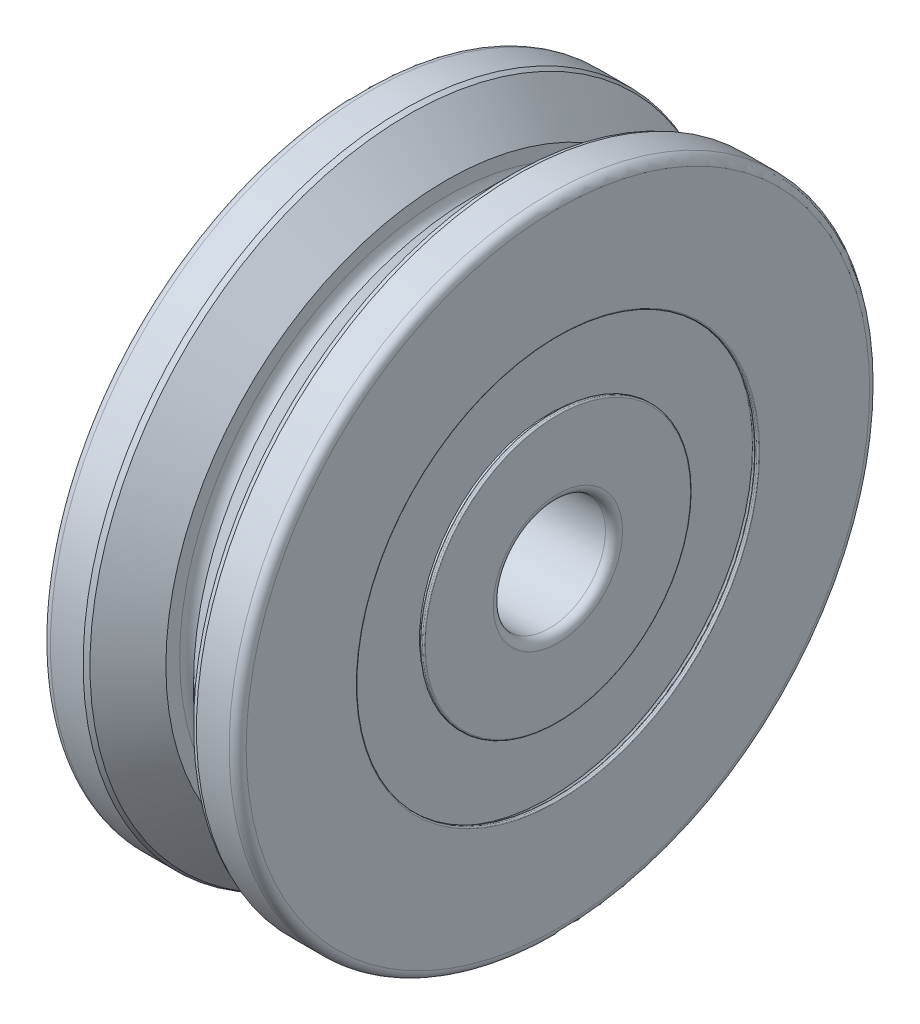
ISO-10303-21;
HEADER;
FILE_DESCRIPTION(('STEP AP214'),'2;1');
FILE_NAME('part.step','',(''),(''),'','','');
FILE_SCHEMA(('AUTOMOTIVE_DESIGN { 1 0 10303 214 1 1 1 1 }'));
ENDSEC;
DATA;
#1=APPLICATION_CONTEXT('core data for automotive mechanical design processes');
#2=APPLICATION_PROTOCOL_DEFINITION('international standard','automotive_design',2000,#1);
#3=PRODUCT_CONTEXT('',#1,'mechanical');
#4=PRODUCT('Part','Part','',(#3));
#5=PRODUCT_RELATED_PRODUCT_CATEGORY('part','',(#4));
#6=PRODUCT_DEFINITION_FORMATION('','',#4);
#7=PRODUCT_DEFINITION_CONTEXT('part definition',#1,'design');
#8=PRODUCT_DEFINITION('design','',#6,#7);
#9=PRODUCT_DEFINITION_SHAPE('','',#8);
#10=(LENGTH_UNIT() NAMED_UNIT(*) SI_UNIT(.MILLI.,.METRE.));
#11=(NAMED_UNIT(*) PLANE_ANGLE_UNIT() SI_UNIT($,.RADIAN.));
#12=(NAMED_UNIT(*) SI_UNIT($,.STERADIAN.) SOLID_ANGLE_UNIT());
#13=UNCERTAINTY_MEASURE_WITH_UNIT(LENGTH_MEASURE(1.E-05),#10,'distance_accuracy_value','');
#14=(GEOMETRIC_REPRESENTATION_CONTEXT(3) GLOBAL_UNCERTAINTY_ASSIGNED_CONTEXT((#13)) GLOBAL_UNIT_ASSIGNED_CONTEXT((#10,
#11,#12)) REPRESENTATION_CONTEXT('',''));
#15=CARTESIAN_POINT('',(0.,0.,0.));
#16=DIRECTION('',(0.,0.,1.));
#17=DIRECTION('',(1.,0.,0.));
#18=AXIS2_PLACEMENT_3D('',#15,#16,#17);
#19=CARTESIAN_POINT('',(-6.89610000000015,0.,0.));
#20=DIRECTION('',(1.,0.,0.));
#21=DIRECTION('',(0.,0.,-1.));
#22=AXIS2_PLACEMENT_3D('',#19,#20,#21);
#23=TOROIDAL_SURFACE('',#22,9.4869,0.101599999999925);
#24=CARTESIAN_POINT('',(-6.9977,0.,0.));
#25=DIRECTION('',(1.,0.,0.));
#26=DIRECTION('',(0.,0.,-1.));
#27=AXIS2_PLACEMENT_3D('',#24,#25,#26);
#28=CIRCLE('',#27,9.4869);
#29=CARTESIAN_POINT('',(-6.9977,0.,-9.4869));
#30=VERTEX_POINT('',#29);
#31=EDGE_CURVE('E10',#30,#30,#28,.T.);
#32=ORIENTED_EDGE('',*,*,#31,.T.);
#33=EDGE_LOOP('',(#32));
#34=FACE_BOUND('',#33,.T.);
#35=CARTESIAN_POINT('',(-6.8961,0.,0.));
#36=DIRECTION('',(1.,0.,0.));
#37=DIRECTION('',(0.,0.,-1.));
#38=AXIS2_PLACEMENT_3D('',#35,#36,#37);
#39=CIRCLE('',#38,9.5885);
#40=CARTESIAN_POINT('',(-6.8961,0.,-9.5885));
#41=VERTEX_POINT('',#40);
#42=EDGE_CURVE('E164',#41,#41,#39,.T.);
#43=ORIENTED_EDGE('',*,*,#42,.F.);
#44=EDGE_LOOP('',(#43));
#45=FACE_BOUND('',#44,.T.);
#46=ADVANCED_FACE('F34',(#34,#45),#23,.T.);
#47=CARTESIAN_POINT('',(-6.99769999999998,9.4869,0.));
#48=DIRECTION('',(-1.,0.,0.));
#49=DIRECTION('',(0.,0.,1.));
#50=AXIS2_PLACEMENT_3D('',#47,#48,#49);
#51=PLANE('',#50);
#52=CARTESIAN_POINT('',(-6.99769999999996,0.,0.));
#53=DIRECTION('',(1.,0.,0.));
#54=DIRECTION('',(0.,0.,-1.));
#55=AXIS2_PLACEMENT_3D('',#52,#53,#54);
#56=CIRCLE('',#55,4.6228);
#57=CARTESIAN_POINT('',(-6.99769999999996,0.,-4.6228));
#58=VERTEX_POINT('',#57);
#59=EDGE_CURVE('E40',#58,#58,#56,.T.);
#60=ORIENTED_EDGE('',*,*,#59,.T.);
#61=EDGE_LOOP('',(#60));
#62=FACE_BOUND('',#61,.T.);
#63=ORIENTED_EDGE('',*,*,#31,.F.);
#64=EDGE_LOOP('',(#63));
#65=FACE_BOUND('',#64,.T.);
#66=ADVANCED_FACE('F172',(#62,#65),#51,.T.);
#67=CARTESIAN_POINT('',(-6.38809999999995,0.,0.));
#68=DIRECTION('',(1.,0.,0.));
#69=DIRECTION('',(0.,0.,-1.));
#70=AXIS2_PLACEMENT_3D('',#67,#68,#69);
#71=TOROIDAL_SURFACE('',#70,4.6228,0.609600000000013);
#72=CARTESIAN_POINT('',(-6.3881,0.,0.));
#73=DIRECTION('',(1.,0.,0.));
#74=DIRECTION('',(0.,0.,-1.));
#75=AXIS2_PLACEMENT_3D('',#72,#73,#74);
#76=CIRCLE('',#75,4.0132);
#77=CARTESIAN_POINT('',(-6.3881,0.,-4.0132));
#78=VERTEX_POINT('',#77);
#79=EDGE_CURVE('E44',#78,#78,#76,.T.);
#80=ORIENTED_EDGE('',*,*,#79,.T.);
#81=EDGE_LOOP('',(#80));
#82=FACE_BOUND('',#81,.T.);
#83=ORIENTED_EDGE('',*,*,#59,.F.);
#84=EDGE_LOOP('',(#83));
#85=FACE_BOUND('',#84,.T.);
#86=ADVANCED_FACE('F176',(#82,#85),#71,.T.);
#87=CARTESIAN_POINT('',(-6.99770000000084,0.,0.));
#88=DIRECTION('',(1.,0.,0.));
#89=DIRECTION('',(0.,0.,-1.));
#90=AXIS2_PLACEMENT_3D('',#87,#88,#89);
#91=CYLINDRICAL_SURFACE('',#90,4.01319999999999);
#92=CARTESIAN_POINT('',(6.3881,0.,0.));
#93=DIRECTION('',(1.,0.,0.));
#94=DIRECTION('',(0.,0.,-1.));
#95=AXIS2_PLACEMENT_3D('',#92,#93,#94);
#96=CIRCLE('',#95,4.01319999999997);
#97=CARTESIAN_POINT('',(6.3881,0.,-4.01319999999997));
#98=VERTEX_POINT('',#97);
#99=EDGE_CURVE('E48',#98,#98,#96,.T.);
#100=ORIENTED_EDGE('',*,*,#99,.T.);
#101=EDGE_LOOP('',(#100));
#102=FACE_BOUND('',#101,.T.);
#103=ORIENTED_EDGE('',*,*,#79,.F.);
#104=EDGE_LOOP('',(#103));
#105=FACE_BOUND('',#104,.T.);
#106=ADVANCED_FACE('F180',(#102,#105),#91,.F.);
#107=CARTESIAN_POINT('',(6.38809999999995,0.,0.));
#108=DIRECTION('',(1.,0.,0.));
#109=DIRECTION('',(0.,0.,-1.));
#110=AXIS2_PLACEMENT_3D('',#107,#108,#109);
#111=TOROIDAL_SURFACE('',#110,4.6228,0.609600000000026);
#112=CARTESIAN_POINT('',(6.9977,0.,0.));
#113=DIRECTION('',(1.,0.,0.));
#114=DIRECTION('',(0.,0.,-1.));
#115=AXIS2_PLACEMENT_3D('',#112,#113,#114);
#116=CIRCLE('',#115,4.6228);
#117=CARTESIAN_POINT('',(6.9977,0.,-4.6228));
#118=VERTEX_POINT('',#117);
#119=EDGE_CURVE('E53',#118,#118,#116,.T.);
#120=ORIENTED_EDGE('',*,*,#119,.T.);
#121=EDGE_LOOP('',(#120));
#122=FACE_BOUND('',#121,.T.);
#123=ORIENTED_EDGE('',*,*,#99,.F.);
#124=EDGE_LOOP('',(#123));
#125=FACE_BOUND('',#124,.T.);
#126=ADVANCED_FACE('F187',(#122,#125),#111,.T.);
#127=CARTESIAN_POINT('',(6.99770000000006,4.6228,0.));
#128=DIRECTION('',(1.,0.,0.));
#129=DIRECTION('',(0.,0.,-1.));
#130=AXIS2_PLACEMENT_3D('',#127,#128,#129);
#131=PLANE('',#130);
#132=CARTESIAN_POINT('',(6.99770000000011,0.,0.));
#133=DIRECTION('',(1.,0.,0.));
#134=DIRECTION('',(0.,0.,-1.));
#135=AXIS2_PLACEMENT_3D('',#132,#133,#134);
#136=CIRCLE('',#135,9.4869);
#137=CARTESIAN_POINT('',(6.99770000000011,0.,-9.4869));
#138=VERTEX_POINT('',#137);
#139=EDGE_CURVE('E56',#138,#138,#136,.T.);
#140=ORIENTED_EDGE('',*,*,#139,.T.);
#141=EDGE_LOOP('',(#140));
#142=FACE_BOUND('',#141,.T.);
#143=ORIENTED_EDGE('',*,*,#119,.F.);
#144=EDGE_LOOP('',(#143));
#145=FACE_BOUND('',#144,.T.);
#146=ADVANCED_FACE('F191',(#142,#145),#131,.T.);
#147=CARTESIAN_POINT('',(6.89610000000015,0.,0.));
#148=DIRECTION('',(1.,0.,0.));
#149=DIRECTION('',(0.,0.,-1.));
#150=AXIS2_PLACEMENT_3D('',#147,#148,#149);
#151=TOROIDAL_SURFACE('',#150,9.4869,0.101599999999963);
#152=CARTESIAN_POINT('',(6.8961,0.,0.));
#153=DIRECTION('',(1.,0.,0.));
#154=DIRECTION('',(0.,0.,-1.));
#155=AXIS2_PLACEMENT_3D('',#152,#153,#154);
#156=CIRCLE('',#155,9.5885);
#157=CARTESIAN_POINT('',(6.8961,0.,-9.5885));
#158=VERTEX_POINT('',#157);
#159=EDGE_CURVE('E59',#158,#158,#156,.T.);
#160=ORIENTED_EDGE('',*,*,#159,.T.);
#161=EDGE_LOOP('',(#160));
#162=FACE_BOUND('',#161,.T.);
#163=ORIENTED_EDGE('',*,*,#139,.F.);
#164=EDGE_LOOP('',(#163));
#165=FACE_BOUND('',#164,.T.);
#166=ADVANCED_FACE('F195',(#162,#165),#151,.T.);
#167=CARTESIAN_POINT('',(-6.99770000000084,0.,0.));
#168=DIRECTION('',(1.,0.,0.));
#169=DIRECTION('',(0.,0.,-1.));
#170=AXIS2_PLACEMENT_3D('',#167,#168,#169);
#171=CYLINDRICAL_SURFACE('',#170,9.58849999999996);
#172=CARTESIAN_POINT('',(6.7945,0.,0.));
#173=DIRECTION('',(1.,0.,0.));
#174=DIRECTION('',(0.,0.,-1.));
#175=AXIS2_PLACEMENT_3D('',#172,#173,#174);
#176=CIRCLE('',#175,9.58849999999992);
#177=CARTESIAN_POINT('',(6.7945,0.,-9.58849999999992));
#178=VERTEX_POINT('',#177);
#179=EDGE_CURVE('E62',#178,#178,#176,.T.);
#180=ORIENTED_EDGE('',*,*,#179,.T.);
#181=EDGE_LOOP('',(#180));
#182=FACE_BOUND('',#181,.T.);
#183=ORIENTED_EDGE('',*,*,#159,.F.);
#184=EDGE_LOOP('',(#183));
#185=FACE_BOUND('',#184,.T.);
#186=ADVANCED_FACE('F199',(#182,#185),#171,.T.);
#187=CARTESIAN_POINT('',(6.79449999999985,0.,0.));
#188=DIRECTION('',(1.,0.,0.));
#189=DIRECTION('',(0.,0.,-1.));
#190=AXIS2_PLACEMENT_3D('',#187,#188,#189);
#191=TOROIDAL_SURFACE('',#190,9.4869,0.101599999999925);
#192=CARTESIAN_POINT('',(6.6929,0.,0.));
#193=DIRECTION('',(1.,0.,0.));
#194=DIRECTION('',(0.,0.,-1.));
#195=AXIS2_PLACEMENT_3D('',#192,#193,#194);
#196=CIRCLE('',#195,9.4869);
#197=CARTESIAN_POINT('',(6.6929,0.,-9.4869));
#198=VERTEX_POINT('',#197);
#199=EDGE_CURVE('E65',#198,#198,#196,.T.);
#200=ORIENTED_EDGE('',*,*,#199,.T.);
#201=EDGE_LOOP('',(#200));
#202=FACE_BOUND('',#201,.T.);
#203=ORIENTED_EDGE('',*,*,#179,.F.);
#204=EDGE_LOOP('',(#203));
#205=FACE_BOUND('',#204,.T.);
#206=ADVANCED_FACE('F203',(#202,#205),#191,.T.);
#207=CARTESIAN_POINT('',(6.6929,9.4869,0.));
#208=DIRECTION('',(-1.,0.,0.));
#209=DIRECTION('',(0.,0.,1.));
#210=AXIS2_PLACEMENT_3D('',#207,#208,#209);
#211=PLANE('',#210);
#212=CARTESIAN_POINT('',(6.6929,0.,0.));
#213=DIRECTION('',(1.,0.,0.));
#214=DIRECTION('',(0.,0.,-1.));
#215=AXIS2_PLACEMENT_3D('',#212,#213,#214);
#216=CIRCLE('',#215,9.2837);
#217=CARTESIAN_POINT('',(6.6929,0.,-9.2837));
#218=VERTEX_POINT('',#217);
#219=EDGE_CURVE('E68',#218,#218,#216,.T.);
#220=ORIENTED_EDGE('',*,*,#219,.T.);
#221=EDGE_LOOP('',(#220));
#222=FACE_BOUND('',#221,.T.);
#223=ORIENTED_EDGE('',*,*,#199,.F.);
#224=EDGE_LOOP('',(#223));
#225=FACE_BOUND('',#224,.T.);
#226=ADVANCED_FACE('F207',(#222,#225),#211,.T.);
#227=CARTESIAN_POINT('',(-6.99770000000084,0.,0.));
#228=DIRECTION('',(1.,0.,0.));
#229=DIRECTION('',(0.,0.,-1.));
#230=AXIS2_PLACEMENT_3D('',#227,#228,#229);
#231=CYLINDRICAL_SURFACE('',#230,9.2837);
#232=CARTESIAN_POINT('',(6.38809999999937,0.,0.));
#233=DIRECTION('',(1.,0.,0.));
#234=DIRECTION('',(0.,0.,-1.));
#235=AXIS2_PLACEMENT_3D('',#232,#233,#234);
#236=CIRCLE('',#235,9.2837);
#237=CARTESIAN_POINT('',(6.38809999999937,0.,-9.2837));
#238=VERTEX_POINT('',#237);
#239=EDGE_CURVE('E71',#238,#238,#236,.T.);
#240=ORIENTED_EDGE('',*,*,#239,.T.);
#241=EDGE_LOOP('',(#240));
#242=FACE_BOUND('',#241,.T.);
#243=ORIENTED_EDGE('',*,*,#219,.F.);
#244=EDGE_LOOP('',(#243));
#245=FACE_BOUND('',#244,.T.);
#246=ADVANCED_FACE('F211',(#242,#245),#231,.T.);
#247=CARTESIAN_POINT('',(6.38809999999932,9.2837,0.));
#248=DIRECTION('',(1.,0.,0.));
#249=DIRECTION('',(0.,0.,-1.));
#250=AXIS2_PLACEMENT_3D('',#247,#248,#249);
#251=PLANE('',#250);
#252=CARTESIAN_POINT('',(6.38809999999927,0.,0.));
#253=DIRECTION('',(1.,0.,0.));
#254=DIRECTION('',(0.,0.,-1.));
#255=AXIS2_PLACEMENT_3D('',#252,#253,#254);
#256=CIRCLE('',#255,14.5224500000002);
#257=CARTESIAN_POINT('',(6.38809999999927,0.,-14.5224500000002));
#258=VERTEX_POINT('',#257);
#259=EDGE_CURVE('E74',#258,#258,#256,.T.);
#260=ORIENTED_EDGE('',*,*,#259,.T.);
#261=EDGE_LOOP('',(#260));
#262=FACE_BOUND('',#261,.T.);
#263=ORIENTED_EDGE('',*,*,#239,.F.);
#264=EDGE_LOOP('',(#263));
#265=FACE_BOUND('',#264,.T.);
#266=ADVANCED_FACE('F215',(#262,#265),#251,.T.);
#267=CARTESIAN_POINT('',(6.48969999999916,0.,0.));
#268=DIRECTION('',(1.,0.,0.));
#269=DIRECTION('',(0.,0.,-1.));
#270=AXIS2_PLACEMENT_3D('',#267,#268,#269);
#271=TOROIDAL_SURFACE('',#270,14.52245,0.101599999999894);
#272=CARTESIAN_POINT('',(6.48969999999916,0.,0.));
#273=DIRECTION('',(1.,0.,0.));
#274=DIRECTION('',(0.,0.,-1.));
#275=AXIS2_PLACEMENT_3D('',#272,#273,#274);
#276=CIRCLE('',#275,14.62405);
#277=CARTESIAN_POINT('',(6.48969999999916,0.,-14.62405));
#278=VERTEX_POINT('',#277);
#279=EDGE_CURVE('E77',#278,#278,#276,.T.);
#280=ORIENTED_EDGE('',*,*,#279,.T.);
#281=EDGE_LOOP('',(#280));
#282=FACE_BOUND('',#281,.T.);
#283=ORIENTED_EDGE('',*,*,#259,.F.);
#284=EDGE_LOOP('',(#283));
#285=FACE_BOUND('',#284,.T.);
#286=ADVANCED_FACE('F219',(#282,#285),#271,.F.);
#287=CARTESIAN_POINT('',(-6.99770000000084,0.,0.));
#288=DIRECTION('',(1.,0.,0.));
#289=DIRECTION('',(0.,0.,-1.));
#290=AXIS2_PLACEMENT_3D('',#287,#288,#289);
#291=CYLINDRICAL_SURFACE('',#290,14.62405);
#292=CARTESIAN_POINT('',(6.6929,0.,0.));
#293=DIRECTION('',(1.,0.,0.));
#294=DIRECTION('',(0.,0.,-1.));
#295=AXIS2_PLACEMENT_3D('',#292,#293,#294);
#296=CIRCLE('',#295,14.62405);
#297=CARTESIAN_POINT('',(6.6929,0.,-14.62405));
#298=VERTEX_POINT('',#297);
#299=EDGE_CURVE('E80',#298,#298,#296,.T.);
#300=ORIENTED_EDGE('',*,*,#299,.T.);
#301=EDGE_LOOP('',(#300));
#302=FACE_BOUND('',#301,.T.);
#303=ORIENTED_EDGE('',*,*,#279,.F.);
#304=EDGE_LOOP('',(#303));
#305=FACE_BOUND('',#304,.T.);
#306=ADVANCED_FACE('F223',(#302,#305),#291,.F.);
#307=CARTESIAN_POINT('',(6.69289999999996,14.62405,0.));
#308=DIRECTION('',(-1.,0.,0.));
#309=DIRECTION('',(0.,0.,1.));
#310=AXIS2_PLACEMENT_3D('',#307,#308,#309);
#311=PLANE('',#310);
#312=CARTESIAN_POINT('',(6.69289999999992,0.,0.));
#313=DIRECTION('',(1.,0.,0.));
#314=DIRECTION('',(0.,0.,-1.));
#315=AXIS2_PLACEMENT_3D('',#312,#313,#314);
#316=CIRCLE('',#315,14.42085);
#317=CARTESIAN_POINT('',(6.69289999999992,0.,-14.42085));
#318=VERTEX_POINT('',#317);
#319=EDGE_CURVE('E83',#318,#318,#316,.T.);
#320=ORIENTED_EDGE('',*,*,#319,.T.);
#321=EDGE_LOOP('',(#320));
#322=FACE_BOUND('',#321,.T.);
#323=ORIENTED_EDGE('',*,*,#299,.F.);
#324=EDGE_LOOP('',(#323));
#325=FACE_BOUND('',#324,.T.);
#326=ADVANCED_FACE('F227',(#322,#325),#311,.T.);
#327=CARTESIAN_POINT('',(6.79449999999971,0.,0.));
#328=DIRECTION('',(1.,0.,0.));
#329=DIRECTION('',(0.,0.,-1.));
#330=AXIS2_PLACEMENT_3D('',#327,#328,#329);
#331=TOROIDAL_SURFACE('',#330,14.42085,0.101599999999789);
#332=CARTESIAN_POINT('',(6.79449999999971,0.,0.));
#333=DIRECTION('',(1.,0.,0.));
#334=DIRECTION('',(0.,0.,-1.));
#335=AXIS2_PLACEMENT_3D('',#332,#333,#334);
#336=CIRCLE('',#335,14.3192500000002);
#337=CARTESIAN_POINT('',(6.79449999999971,0.,-14.3192500000002));
#338=VERTEX_POINT('',#337);
#339=EDGE_CURVE('E86',#338,#338,#336,.T.);
#340=ORIENTED_EDGE('',*,*,#339,.T.);
#341=EDGE_LOOP('',(#340));
#342=FACE_BOUND('',#341,.T.);
#343=ORIENTED_EDGE('',*,*,#319,.F.);
#344=EDGE_LOOP('',(#343));
#345=FACE_BOUND('',#344,.T.);
#346=ADVANCED_FACE('F231',(#342,#345),#331,.T.);
#347=CARTESIAN_POINT('',(-6.99770000000084,0.,0.));
#348=DIRECTION('',(1.,0.,0.));
#349=DIRECTION('',(0.,0.,-1.));
#350=AXIS2_PLACEMENT_3D('',#347,#348,#349);
#351=CYLINDRICAL_SURFACE('',#350,14.3192500000002);
#352=CARTESIAN_POINT('',(6.89610000000039,0.,0.));
#353=DIRECTION('',(1.,0.,0.));
#354=DIRECTION('',(0.,0.,-1.));
#355=AXIS2_PLACEMENT_3D('',#352,#353,#354);
#356=CIRCLE('',#355,14.3192500000002);
#357=CARTESIAN_POINT('',(6.89610000000039,0.,-14.3192500000002));
#358=VERTEX_POINT('',#357);
#359=EDGE_CURVE('E89',#358,#358,#356,.T.);
#360=ORIENTED_EDGE('',*,*,#359,.T.);
#361=EDGE_LOOP('',(#360));
#362=FACE_BOUND('',#361,.T.);
#363=ORIENTED_EDGE('',*,*,#339,.F.);
#364=EDGE_LOOP('',(#363));
#365=FACE_BOUND('',#364,.T.);
#366=ADVANCED_FACE('F235',(#362,#365),#351,.F.);
#367=CARTESIAN_POINT('',(6.89610000000039,0.,0.));
#368=DIRECTION('',(1.,0.,0.));
#369=DIRECTION('',(0.,0.,-1.));
#370=AXIS2_PLACEMENT_3D('',#367,#368,#369);
#371=TOROIDAL_SURFACE('',#370,14.4208499999998,0.101599999999594);
#372=CARTESIAN_POINT('',(6.9977,0.,0.));
#373=DIRECTION('',(1.,0.,0.));
#374=DIRECTION('',(0.,0.,-1.));
#375=AXIS2_PLACEMENT_3D('',#372,#373,#374);
#376=CIRCLE('',#375,14.42085);
#377=CARTESIAN_POINT('',(6.9977,0.,-14.42085));
#378=VERTEX_POINT('',#377);
#379=EDGE_CURVE('E92',#378,#378,#376,.T.);
#380=ORIENTED_EDGE('',*,*,#379,.T.);
#381=EDGE_LOOP('',(#380));
#382=FACE_BOUND('',#381,.T.);
#383=ORIENTED_EDGE('',*,*,#359,.F.);
#384=EDGE_LOOP('',(#383));
#385=FACE_BOUND('',#384,.T.);
#386=ADVANCED_FACE('F239',(#382,#385),#371,.T.);
#387=CARTESIAN_POINT('',(6.99769999999998,14.42085,0.));
#388=DIRECTION('',(1.,0.,0.));
#389=DIRECTION('',(0.,0.,-1.));
#390=AXIS2_PLACEMENT_3D('',#387,#388,#389);
#391=PLANE('',#390);
#392=CARTESIAN_POINT('',(6.99769999999997,0.,0.));
#393=DIRECTION('',(1.,0.,0.));
#394=DIRECTION('',(0.,0.,-1.));
#395=AXIS2_PLACEMENT_3D('',#392,#393,#394);
#396=CIRCLE('',#395,22.2885000000001);
#397=CARTESIAN_POINT('',(6.99769999999997,0.,-22.2885000000001));
#398=VERTEX_POINT('',#397);
#399=EDGE_CURVE('E95',#398,#398,#396,.T.);
#400=ORIENTED_EDGE('',*,*,#399,.T.);
#401=EDGE_LOOP('',(#400));
#402=FACE_BOUND('',#401,.T.);
#403=ORIENTED_EDGE('',*,*,#379,.F.);
#404=EDGE_LOOP('',(#403));
#405=FACE_BOUND('',#404,.T.);
#406=ADVANCED_FACE('F243',(#402,#405),#391,.T.);
#407=CARTESIAN_POINT('',(6.38809999999983,0.,0.));
#408=DIRECTION('',(1.,0.,0.));
#409=DIRECTION('',(0.,0.,-1.));
#410=AXIS2_PLACEMENT_3D('',#407,#408,#409);
#411=TOROIDAL_SURFACE('',#410,22.2885000000001,0.609600000000144);
#412=CARTESIAN_POINT('',(6.38809999999983,0.,0.));
#413=DIRECTION('',(1.,0.,0.));
#414=DIRECTION('',(0.,0.,-1.));
#415=AXIS2_PLACEMENT_3D('',#412,#413,#414);
#416=CIRCLE('',#415,22.8981000000003);
#417=CARTESIAN_POINT('',(6.38809999999983,0.,-22.8981000000003));
#418=VERTEX_POINT('',#417);
#419=EDGE_CURVE('E98',#418,#418,#416,.T.);
#420=ORIENTED_EDGE('',*,*,#419,.T.);
#421=EDGE_LOOP('',(#420));
#422=FACE_BOUND('',#421,.T.);
#423=ORIENTED_EDGE('',*,*,#399,.F.);
#424=EDGE_LOOP('',(#423));
#425=FACE_BOUND('',#424,.T.);
#426=ADVANCED_FACE('F247',(#422,#425),#411,.T.);
#427=CARTESIAN_POINT('',(-6.99770000000084,0.,0.));
#428=DIRECTION('',(1.,0.,0.));
#429=DIRECTION('',(0.,0.,-1.));
#430=AXIS2_PLACEMENT_3D('',#427,#428,#429);
#431=CYLINDRICAL_SURFACE('',#430,22.8981000000003);
#432=CARTESIAN_POINT('',(4.0508560454006,0.,0.));
#433=DIRECTION('',(1.,0.,0.));
#434=DIRECTION('',(0.,0.,-1.));
#435=AXIS2_PLACEMENT_3D('',#432,#433,#434);
#436=CIRCLE('',#435,22.8981000000003);
#437=CARTESIAN_POINT('',(4.0508560454006,0.,-22.8981000000003));
#438=VERTEX_POINT('',#437);
#439=EDGE_CURVE('E101',#438,#438,#436,.T.);
#440=ORIENTED_EDGE('',*,*,#439,.T.);
#441=EDGE_LOOP('',(#440));
#442=FACE_BOUND('',#441,.T.);
#443=ORIENTED_EDGE('',*,*,#419,.F.);
#444=EDGE_LOOP('',(#443));
#445=FACE_BOUND('',#444,.T.);
#446=ADVANCED_FACE('F251',(#442,#445),#431,.T.);
#447=CARTESIAN_POINT('',(4.0508560454006,0.,0.));
#448=DIRECTION('',(1.,0.,0.));
#449=DIRECTION('',(0.,0.,-1.));
#450=AXIS2_PLACEMENT_3D('',#447,#448,#449);
#451=CONICAL_SURFACE('',#450,22.8981000000003,0.392699078605482);
#452=CARTESIAN_POINT('',(3.7039719474635,0.,0.));
#453=DIRECTION('',(1.,0.,0.));
#454=DIRECTION('',(0.,0.,-1.));
#455=AXIS2_PLACEMENT_3D('',#452,#453,#454);
#456=CIRCLE('',#455,22.7544159033203);
#457=CARTESIAN_POINT('',(3.7039719474635,0.,-22.7544159033203));
#458=VERTEX_POINT('',#457);
#459=EDGE_CURVE('E104',#458,#458,#456,.T.);
#460=ORIENTED_EDGE('',*,*,#459,.T.);
#461=EDGE_LOOP('',(#460));
#462=FACE_BOUND('',#461,.T.);
#463=ORIENTED_EDGE('',*,*,#439,.F.);
#464=EDGE_LOOP('',(#463));
#465=FACE_BOUND('',#464,.T.);
#466=ADVANCED_FACE('F255',(#462,#465),#451,.T.);
#467=CARTESIAN_POINT('',(3.7039719474635,0.,0.));
#468=DIRECTION('',(1.,0.,0.));
#469=DIRECTION('',(0.,0.,-1.));
#470=AXIS2_PLACEMENT_3D('',#467,#468,#469);
#471=CONICAL_SURFACE('',#470,22.7544159033203,0.785398163397448);
#472=CARTESIAN_POINT('',(0.990599999021609,0.,0.));
#473=DIRECTION('',(1.,0.,0.));
#474=DIRECTION('',(0.,0.,-1.));
#475=AXIS2_PLACEMENT_3D('',#472,#473,#474);
#476=CIRCLE('',#475,20.0410439548784);
#477=CARTESIAN_POINT('',(0.990599999021609,0.,-20.0410439548784));
#478=VERTEX_POINT('',#477);
#479=EDGE_CURVE('E107',#478,#478,#476,.T.);
#480=ORIENTED_EDGE('',*,*,#479,.T.);
#481=EDGE_LOOP('',(#480));
#482=FACE_BOUND('',#481,.T.);
#483=ORIENTED_EDGE('',*,*,#459,.F.);
#484=EDGE_LOOP('',(#483));
#485=FACE_BOUND('',#484,.T.);
#486=ADVANCED_FACE('F259',(#482,#485),#471,.T.);
#487=CARTESIAN_POINT('',(0.990599999021609,20.0410439548784,0.));
#488=DIRECTION('',(-1.,0.,0.));
#489=DIRECTION('',(0.,0.,1.));
#490=AXIS2_PLACEMENT_3D('',#487,#488,#489);
#491=PLANE('',#490);
#492=CARTESIAN_POINT('',(0.990599999021609,0.,0.));
#493=DIRECTION('',(1.,0.,0.));
#494=DIRECTION('',(0.,0.,-1.));
#495=AXIS2_PLACEMENT_3D('',#492,#493,#494);
#496=CIRCLE('',#495,19.0500000009784);
#497=CARTESIAN_POINT('',(0.990599999021609,0.,-19.0500000009784));
#498=VERTEX_POINT('',#497);
#499=EDGE_CURVE('E110',#498,#498,#496,.T.);
#500=ORIENTED_EDGE('',*,*,#499,.T.);
#501=EDGE_LOOP('',(#500));
#502=FACE_BOUND('',#501,.T.);
#503=ORIENTED_EDGE('',*,*,#479,.F.);
#504=EDGE_LOOP('',(#503));
#505=FACE_BOUND('',#504,.T.);
#506=ADVANCED_FACE('F263',(#502,#505),#491,.T.);
#507=CARTESIAN_POINT('',(-2.88831458750138E-13,0.,0.));
#508=DIRECTION('',(1.,0.,0.));
#509=DIRECTION('',(0.,0.,-1.));
#510=AXIS2_PLACEMENT_3D('',#507,#508,#509);
#511=TOROIDAL_SURFACE('',#510,19.0500000009784,0.990599999021898);
#512=CARTESIAN_POINT('',(-0.990599999022187,0.,0.));
#513=DIRECTION('',(1.,0.,0.));
#514=DIRECTION('',(0.,0.,-1.));
#515=AXIS2_PLACEMENT_3D('',#512,#513,#514);
#516=CIRCLE('',#515,19.0500000009784);
#517=CARTESIAN_POINT('',(-0.990599999022187,0.,-19.0500000009784));
#518=VERTEX_POINT('',#517);
#519=EDGE_CURVE('E113',#518,#518,#516,.T.);
#520=ORIENTED_EDGE('',*,*,#519,.T.);
#521=EDGE_LOOP('',(#520));
#522=FACE_BOUND('',#521,.T.);
#523=ORIENTED_EDGE('',*,*,#499,.F.);
#524=EDGE_LOOP('',(#523));
#525=FACE_BOUND('',#524,.T.);
#526=ADVANCED_FACE('F267',(#522,#525),#511,.F.);
#527=CARTESIAN_POINT('',(-0.990599999022187,19.0500000009784,0.));
#528=DIRECTION('',(1.,0.,0.));
#529=DIRECTION('',(0.,0.,-1.));
#530=AXIS2_PLACEMENT_3D('',#527,#528,#529);
#531=PLANE('',#530);
#532=CARTESIAN_POINT('',(-0.990599999022187,0.,0.));
#533=DIRECTION('',(1.,0.,0.));
#534=DIRECTION('',(0.,0.,-1.));
#535=AXIS2_PLACEMENT_3D('',#532,#533,#534);
#536=CIRCLE('',#535,20.0410439548784);
#537=CARTESIAN_POINT('',(-0.990599999022187,0.,-20.0410439548784));
#538=VERTEX_POINT('',#537);
#539=EDGE_CURVE('E116',#538,#538,#536,.T.);
#540=ORIENTED_EDGE('',*,*,#539,.T.);
#541=EDGE_LOOP('',(#540));
#542=FACE_BOUND('',#541,.T.);
#543=ORIENTED_EDGE('',*,*,#519,.F.);
#544=EDGE_LOOP('',(#543));
#545=FACE_BOUND('',#544,.T.);
#546=ADVANCED_FACE('F271',(#542,#545),#531,.T.);
#547=CARTESIAN_POINT('',(-0.990599999022187,0.,0.));
#548=DIRECTION('',(-1.,0.,0.));
#549=DIRECTION('',(0.,0.,1.));
#550=AXIS2_PLACEMENT_3D('',#547,#548,#549);
#551=CONICAL_SURFACE('',#550,20.0410439548784,0.785398163397448);
#552=CARTESIAN_POINT('',(-3.70397194746409,0.,0.));
#553=DIRECTION('',(1.,0.,0.));
#554=DIRECTION('',(0.,0.,-1.));
#555=AXIS2_PLACEMENT_3D('',#552,#553,#554);
#556=CIRCLE('',#555,22.7544159033203);
#557=CARTESIAN_POINT('',(-3.70397194746409,0.,-22.7544159033203));
#558=VERTEX_POINT('',#557);
#559=EDGE_CURVE('E119',#558,#558,#556,.T.);
#560=ORIENTED_EDGE('',*,*,#559,.T.);
#561=EDGE_LOOP('',(#560));
#562=FACE_BOUND('',#561,.T.);
#563=ORIENTED_EDGE('',*,*,#539,.F.);
#564=EDGE_LOOP('',(#563));
#565=FACE_BOUND('',#564,.T.);
#566=ADVANCED_FACE('F275',(#562,#565),#551,.T.);
#567=CARTESIAN_POINT('',(-3.70397194746409,0.,0.));
#568=DIRECTION('',(-1.,0.,0.));
#569=DIRECTION('',(0.,0.,1.));
#570=AXIS2_PLACEMENT_3D('',#567,#568,#569);
#571=CONICAL_SURFACE('',#570,22.7544159033203,0.392699078605468);
#572=CARTESIAN_POINT('',(-4.05085604540118,0.,0.));
#573=DIRECTION('',(1.,0.,0.));
#574=DIRECTION('',(0.,0.,-1.));
#575=AXIS2_PLACEMENT_3D('',#572,#573,#574);
#576=CIRCLE('',#575,22.8981000000003);
#577=CARTESIAN_POINT('',(-4.05085604540118,0.,-22.8981000000003));
#578=VERTEX_POINT('',#577);
#579=EDGE_CURVE('E122',#578,#578,#576,.T.);
#580=ORIENTED_EDGE('',*,*,#579,.T.);
#581=EDGE_LOOP('',(#580));
#582=FACE_BOUND('',#581,.T.);
#583=ORIENTED_EDGE('',*,*,#559,.F.);
#584=EDGE_LOOP('',(#583));
#585=FACE_BOUND('',#584,.T.);
#586=ADVANCED_FACE('F279',(#582,#585),#571,.T.);
#587=CARTESIAN_POINT('',(-6.99770000000084,0.,0.));
#588=DIRECTION('',(1.,0.,0.));
#589=DIRECTION('',(0.,0.,-1.));
#590=AXIS2_PLACEMENT_3D('',#587,#588,#589);
#591=CYLINDRICAL_SURFACE('',#590,22.8981000000003);
#592=CARTESIAN_POINT('',(-6.38809999999971,0.,0.));
#593=DIRECTION('',(1.,0.,0.));
#594=DIRECTION('',(0.,0.,-1.));
#595=AXIS2_PLACEMENT_3D('',#592,#593,#594);
#596=CIRCLE('',#595,22.8981000000003);
#597=CARTESIAN_POINT('',(-6.38809999999971,0.,-22.8981000000003));
#598=VERTEX_POINT('',#597);
#599=EDGE_CURVE('E125',#598,#598,#596,.T.);
#600=ORIENTED_EDGE('',*,*,#599,.T.);
#601=EDGE_LOOP('',(#600));
#602=FACE_BOUND('',#601,.T.);
#603=ORIENTED_EDGE('',*,*,#579,.F.);
#604=EDGE_LOOP('',(#603));
#605=FACE_BOUND('',#604,.T.);
#606=ADVANCED_FACE('F283',(#602,#605),#591,.T.);
#607=CARTESIAN_POINT('',(-6.38809999999971,0.,0.));
#608=DIRECTION('',(1.,0.,0.));
#609=DIRECTION('',(0.,0.,-1.));
#610=AXIS2_PLACEMENT_3D('',#607,#608,#609);
#611=TOROIDAL_SURFACE('',#610,22.2885,0.609600000000294);
#612=CARTESIAN_POINT('',(-6.9977,0.,0.));
#613=DIRECTION('',(1.,0.,0.));
#614=DIRECTION('',(0.,0.,-1.));
#615=AXIS2_PLACEMENT_3D('',#612,#613,#614);
#616=CIRCLE('',#615,22.2885);
#617=CARTESIAN_POINT('',(-6.9977,0.,-22.2885));
#618=VERTEX_POINT('',#617);
#619=EDGE_CURVE('E128',#618,#618,#616,.T.);
#620=ORIENTED_EDGE('',*,*,#619,.T.);
#621=EDGE_LOOP('',(#620));
#622=FACE_BOUND('',#621,.T.);
#623=ORIENTED_EDGE('',*,*,#599,.F.);
#624=EDGE_LOOP('',(#623));
#625=FACE_BOUND('',#624,.T.);
#626=ADVANCED_FACE('F287',(#622,#625),#611,.T.);
#627=CARTESIAN_POINT('',(-6.9977,22.2885,0.));
#628=DIRECTION('',(-1.,0.,0.));
#629=DIRECTION('',(0.,0.,1.));
#630=AXIS2_PLACEMENT_3D('',#627,#628,#629);
#631=PLANE('',#630);
#632=CARTESIAN_POINT('',(-6.9977,0.,0.));
#633=DIRECTION('',(1.,0.,0.));
#634=DIRECTION('',(0.,0.,-1.));
#635=AXIS2_PLACEMENT_3D('',#632,#633,#634);
#636=CIRCLE('',#635,14.42085);
#637=CARTESIAN_POINT('',(-6.9977,0.,-14.42085));
#638=VERTEX_POINT('',#637);
#639=EDGE_CURVE('E131',#638,#638,#636,.T.);
#640=ORIENTED_EDGE('',*,*,#639,.T.);
#641=EDGE_LOOP('',(#640));
#642=FACE_BOUND('',#641,.T.);
#643=ORIENTED_EDGE('',*,*,#619,.F.);
#644=EDGE_LOOP('',(#643));
#645=FACE_BOUND('',#644,.T.);
#646=ADVANCED_FACE('F291',(#642,#645),#631,.T.);
#647=CARTESIAN_POINT('',(-6.89610000000021,0.,0.));
#648=DIRECTION('',(1.,0.,0.));
#649=DIRECTION('',(0.,0.,-1.));
#650=AXIS2_PLACEMENT_3D('',#647,#648,#649);
#651=TOROIDAL_SURFACE('',#650,14.42085,0.10159999999979);
#652=CARTESIAN_POINT('',(-6.89610000000021,0.,0.));
#653=DIRECTION('',(1.,0.,0.));
#654=DIRECTION('',(0.,0.,-1.));
#655=AXIS2_PLACEMENT_3D('',#652,#653,#654);
#656=CIRCLE('',#655,14.3192500000002);
#657=CARTESIAN_POINT('',(-6.89610000000021,0.,-14.3192500000002));
#658=VERTEX_POINT('',#657);
#659=EDGE_CURVE('E134',#658,#658,#656,.T.);
#660=ORIENTED_EDGE('',*,*,#659,.T.);
#661=EDGE_LOOP('',(#660));
#662=FACE_BOUND('',#661,.T.);
#663=ORIENTED_EDGE('',*,*,#639,.F.);
#664=EDGE_LOOP('',(#663));
#665=FACE_BOUND('',#664,.T.);
#666=ADVANCED_FACE('F295',(#662,#665),#651,.T.);
#667=CARTESIAN_POINT('',(-6.99770000000084,0.,0.));
#668=DIRECTION('',(1.,0.,0.));
#669=DIRECTION('',(0.,0.,-1.));
#670=AXIS2_PLACEMENT_3D('',#667,#668,#669);
#671=CYLINDRICAL_SURFACE('',#670,14.3192500000002);
#672=CARTESIAN_POINT('',(-6.79449999999946,0.,0.));
#673=DIRECTION('',(1.,0.,0.));
#674=DIRECTION('',(0.,0.,-1.));
#675=AXIS2_PLACEMENT_3D('',#672,#673,#674);
#676=CIRCLE('',#675,14.3192500000003);
#677=CARTESIAN_POINT('',(-6.79449999999946,0.,-14.3192500000003));
#678=VERTEX_POINT('',#677);
#679=EDGE_CURVE('E137',#678,#678,#676,.T.);
#680=ORIENTED_EDGE('',*,*,#679,.T.);
#681=EDGE_LOOP('',(#680));
#682=FACE_BOUND('',#681,.T.);
#683=ORIENTED_EDGE('',*,*,#659,.F.);
#684=EDGE_LOOP('',(#683));
#685=FACE_BOUND('',#684,.T.);
#686=ADVANCED_FACE('F299',(#682,#685),#671,.F.);
#687=CARTESIAN_POINT('',(-6.79449999999946,0.,0.));
#688=DIRECTION('',(1.,0.,0.));
#689=DIRECTION('',(0.,0.,-1.));
#690=AXIS2_PLACEMENT_3D('',#687,#688,#689);
#691=TOROIDAL_SURFACE('',#690,14.4208499999998,0.101599999999522);
#692=CARTESIAN_POINT('',(-6.6929,0.,0.));
#693=DIRECTION('',(1.,0.,0.));
#694=DIRECTION('',(0.,0.,-1.));
#695=AXIS2_PLACEMENT_3D('',#692,#693,#694);
#696=CIRCLE('',#695,14.42085);
#697=CARTESIAN_POINT('',(-6.6929,0.,-14.42085));
#698=VERTEX_POINT('',#697);
#699=EDGE_CURVE('E140',#698,#698,#696,.T.);
#700=ORIENTED_EDGE('',*,*,#699,.T.);
#701=EDGE_LOOP('',(#700));
#702=FACE_BOUND('',#701,.T.);
#703=ORIENTED_EDGE('',*,*,#679,.F.);
#704=EDGE_LOOP('',(#703));
#705=FACE_BOUND('',#704,.T.);
#706=ADVANCED_FACE('F303',(#702,#705),#691,.T.);
#707=CARTESIAN_POINT('',(-6.6929,14.42085,0.));
#708=DIRECTION('',(1.,0.,0.));
#709=DIRECTION('',(0.,0.,-1.));
#710=AXIS2_PLACEMENT_3D('',#707,#708,#709);
#711=PLANE('',#710);
#712=CARTESIAN_POINT('',(-6.6929,0.,0.));
#713=DIRECTION('',(1.,0.,0.));
#714=DIRECTION('',(0.,0.,-1.));
#715=AXIS2_PLACEMENT_3D('',#712,#713,#714);
#716=CIRCLE('',#715,14.62405);
#717=CARTESIAN_POINT('',(-6.6929,0.,-14.62405));
#718=VERTEX_POINT('',#717);
#719=EDGE_CURVE('E143',#718,#718,#716,.T.);
#720=ORIENTED_EDGE('',*,*,#719,.T.);
#721=EDGE_LOOP('',(#720));
#722=FACE_BOUND('',#721,.T.);
#723=ORIENTED_EDGE('',*,*,#699,.F.);
#724=EDGE_LOOP('',(#723));
#725=FACE_BOUND('',#724,.T.);
#726=ADVANCED_FACE('F307',(#722,#725),#711,.T.);
#727=CARTESIAN_POINT('',(-6.99770000000084,0.,0.));
#728=DIRECTION('',(1.,0.,0.));
#729=DIRECTION('',(0.,0.,-1.));
#730=AXIS2_PLACEMENT_3D('',#727,#728,#729);
#731=CYLINDRICAL_SURFACE('',#730,14.62405);
#732=CARTESIAN_POINT('',(-6.48969999999916,0.,0.));
#733=DIRECTION('',(1.,0.,0.));
#734=DIRECTION('',(0.,0.,-1.));
#735=AXIS2_PLACEMENT_3D('',#732,#733,#734);
#736=CIRCLE('',#735,14.62405);
#737=CARTESIAN_POINT('',(-6.48969999999916,0.,-14.62405));
#738=VERTEX_POINT('',#737);
#739=EDGE_CURVE('E146',#738,#738,#736,.T.);
#740=ORIENTED_EDGE('',*,*,#739,.T.);
#741=EDGE_LOOP('',(#740));
#742=FACE_BOUND('',#741,.T.);
#743=ORIENTED_EDGE('',*,*,#719,.F.);
#744=EDGE_LOOP('',(#743));
#745=FACE_BOUND('',#744,.T.);
#746=ADVANCED_FACE('F311',(#742,#745),#731,.F.);
#747=CARTESIAN_POINT('',(-6.48969999999916,0.,0.));
#748=DIRECTION('',(1.,0.,0.));
#749=DIRECTION('',(0.,0.,-1.));
#750=AXIS2_PLACEMENT_3D('',#747,#748,#749);
#751=TOROIDAL_SURFACE('',#750,14.5224500000004,0.10159999999958);
#752=CARTESIAN_POINT('',(-6.38809999999958,0.,0.));
#753=DIRECTION('',(1.,0.,0.));
#754=DIRECTION('',(0.,0.,-1.));
#755=AXIS2_PLACEMENT_3D('',#752,#753,#754);
#756=CIRCLE('',#755,14.5224500000004);
#757=CARTESIAN_POINT('',(-6.38809999999958,0.,-14.5224500000004));
#758=VERTEX_POINT('',#757);
#759=EDGE_CURVE('E149',#758,#758,#756,.T.);
#760=ORIENTED_EDGE('',*,*,#759,.T.);
#761=EDGE_LOOP('',(#760));
#762=FACE_BOUND('',#761,.T.);
#763=ORIENTED_EDGE('',*,*,#739,.F.);
#764=EDGE_LOOP('',(#763));
#765=FACE_BOUND('',#764,.T.);
#766=ADVANCED_FACE('F315',(#762,#765),#751,.F.);
#767=CARTESIAN_POINT('',(-6.38809999999958,14.5224500000004,0.));
#768=DIRECTION('',(-1.,0.,0.));
#769=DIRECTION('',(0.,0.,1.));
#770=AXIS2_PLACEMENT_3D('',#767,#768,#769);
#771=PLANE('',#770);
#772=CARTESIAN_POINT('',(-6.38809999999958,0.,0.));
#773=DIRECTION('',(1.,0.,0.));
#774=DIRECTION('',(0.,0.,-1.));
#775=AXIS2_PLACEMENT_3D('',#772,#773,#774);
#776=CIRCLE('',#775,9.2837);
#777=CARTESIAN_POINT('',(-6.38809999999958,0.,-9.2837));
#778=VERTEX_POINT('',#777);
#779=EDGE_CURVE('E152',#778,#778,#776,.T.);
#780=ORIENTED_EDGE('',*,*,#779,.T.);
#781=EDGE_LOOP('',(#780));
#782=FACE_BOUND('',#781,.T.);
#783=ORIENTED_EDGE('',*,*,#759,.F.);
#784=EDGE_LOOP('',(#783));
#785=FACE_BOUND('',#784,.T.);
#786=ADVANCED_FACE('F319',(#782,#785),#771,.T.);
#787=CARTESIAN_POINT('',(-6.99770000000084,0.,0.));
#788=DIRECTION('',(1.,0.,0.));
#789=DIRECTION('',(0.,0.,-1.));
#790=AXIS2_PLACEMENT_3D('',#787,#788,#789);
#791=CYLINDRICAL_SURFACE('',#790,9.2837);
#792=CARTESIAN_POINT('',(-6.6929,0.,0.));
#793=DIRECTION('',(1.,0.,0.));
#794=DIRECTION('',(0.,0.,-1.));
#795=AXIS2_PLACEMENT_3D('',#792,#793,#794);
#796=CIRCLE('',#795,9.2837);
#797=CARTESIAN_POINT('',(-6.6929,0.,-9.2837));
#798=VERTEX_POINT('',#797);
#799=EDGE_CURVE('E155',#798,#798,#796,.T.);
#800=ORIENTED_EDGE('',*,*,#799,.T.);
#801=EDGE_LOOP('',(#800));
#802=FACE_BOUND('',#801,.T.);
#803=ORIENTED_EDGE('',*,*,#779,.F.);
#804=EDGE_LOOP('',(#803));
#805=FACE_BOUND('',#804,.T.);
#806=ADVANCED_FACE('F323',(#802,#805),#791,.T.);
#807=CARTESIAN_POINT('',(-6.69289999999994,9.2837,0.));
#808=DIRECTION('',(1.,0.,0.));
#809=DIRECTION('',(0.,0.,-1.));
#810=AXIS2_PLACEMENT_3D('',#807,#808,#809);
#811=PLANE('',#810);
#812=CARTESIAN_POINT('',(-6.69289999999988,0.,0.));
#813=DIRECTION('',(1.,0.,0.));
#814=DIRECTION('',(0.,0.,-1.));
#815=AXIS2_PLACEMENT_3D('',#812,#813,#814);
#816=CIRCLE('',#815,9.4869);
#817=CARTESIAN_POINT('',(-6.69289999999988,0.,-9.4869));
#818=VERTEX_POINT('',#817);
#819=EDGE_CURVE('E158',#818,#818,#816,.T.);
#820=ORIENTED_EDGE('',*,*,#819,.T.);
#821=EDGE_LOOP('',(#820));
#822=FACE_BOUND('',#821,.T.);
#823=ORIENTED_EDGE('',*,*,#799,.F.);
#824=EDGE_LOOP('',(#823));
#825=FACE_BOUND('',#824,.T.);
#826=ADVANCED_FACE('F327',(#822,#825),#811,.T.);
#827=CARTESIAN_POINT('',(-6.79449999999985,0.,0.));
#828=DIRECTION('',(1.,0.,0.));
#829=DIRECTION('',(0.,0.,-1.));
#830=AXIS2_PLACEMENT_3D('',#827,#828,#829);
#831=TOROIDAL_SURFACE('',#830,9.4869,0.101599999999963);
#832=CARTESIAN_POINT('',(-6.7945,0.,0.));
#833=DIRECTION('',(1.,0.,0.));
#834=DIRECTION('',(0.,0.,-1.));
#835=AXIS2_PLACEMENT_3D('',#832,#833,#834);
#836=CIRCLE('',#835,9.5885);
#837=CARTESIAN_POINT('',(-6.7945,0.,-9.5885));
#838=VERTEX_POINT('',#837);
#839=EDGE_CURVE('E161',#838,#838,#836,.T.);
#840=ORIENTED_EDGE('',*,*,#839,.T.);
#841=EDGE_LOOP('',(#840));
#842=FACE_BOUND('',#841,.T.);
#843=ORIENTED_EDGE('',*,*,#819,.F.);
#844=EDGE_LOOP('',(#843));
#845=FACE_BOUND('',#844,.T.);
#846=ADVANCED_FACE('F331',(#842,#845),#831,.T.);
#847=CARTESIAN_POINT('',(-6.99770000000084,0.,0.));
#848=DIRECTION('',(1.,0.,0.));
#849=DIRECTION('',(0.,0.,-1.));
#850=AXIS2_PLACEMENT_3D('',#847,#848,#849);
#851=CYLINDRICAL_SURFACE('',#850,9.5885);
#852=ORIENTED_EDGE('',*,*,#42,.T.);
#853=EDGE_LOOP('',(#852));
#854=FACE_BOUND('',#853,.T.);
#855=ORIENTED_EDGE('',*,*,#839,.F.);
#856=EDGE_LOOP('',(#855));
#857=FACE_BOUND('',#856,.T.);
#858=ADVANCED_FACE('F168',(#854,#857),#851,.T.);
#859=CLOSED_SHELL('',(#46,#66,#86,#106,#126,#146,#166,#186,#206,#226,#246,#266,#286,#306,#326,
#346,#366,#386,#406,#426,#446,#466,#486,#506,#526,#546,#566,#586,#606,#626,#646,#666,#686,#706,
#726,#746,#766,#786,#806,#826,#846,#858));
#860=MANIFOLD_SOLID_BREP('B2',#859);
#861=ADVANCED_BREP_SHAPE_REPRESENTATION('',(#18,#860),#14);
#862=SHAPE_DEFINITION_REPRESENTATION(#9,#861);
ENDSEC;
END-ISO-10303-21;
